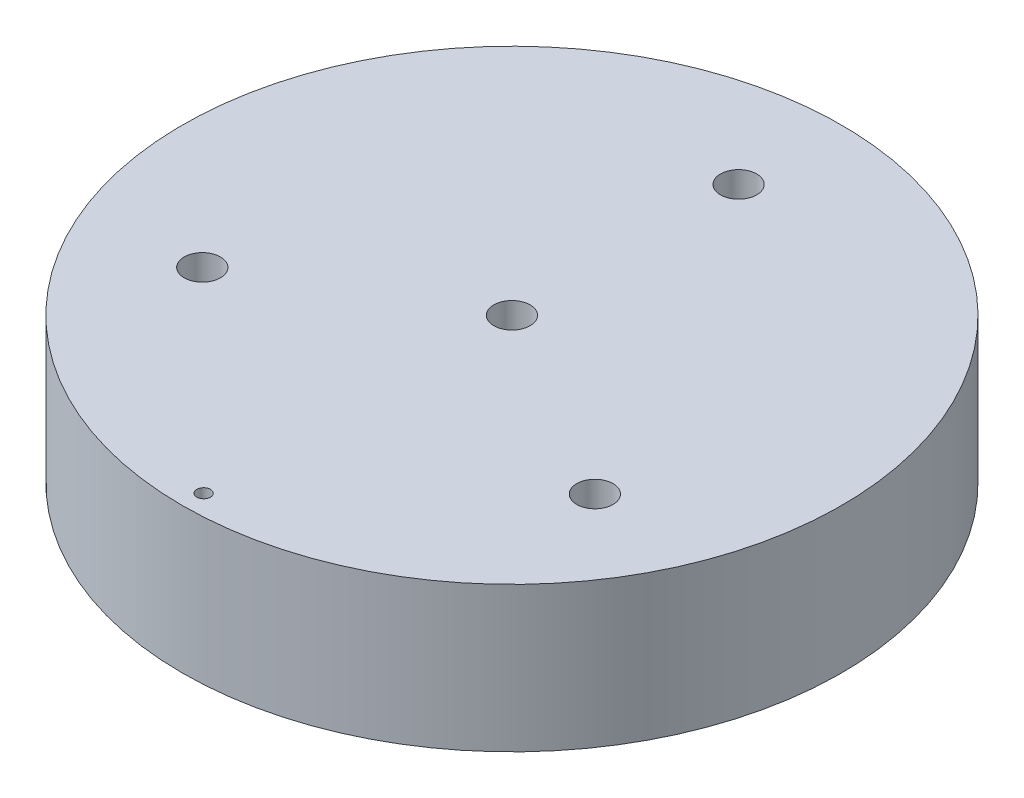
ISO-10303-21;
HEADER;
FILE_DESCRIPTION(('STEP AP214'),'2;1');
FILE_NAME('part.step','',(''),(''),'','','');
FILE_SCHEMA(('AUTOMOTIVE_DESIGN { 1 0 10303 214 1 1 1 1 }'));
ENDSEC;
DATA;
#1=APPLICATION_CONTEXT('core data for automotive mechanical design processes');
#2=APPLICATION_PROTOCOL_DEFINITION('international standard','automotive_design',2000,#1);
#3=PRODUCT_CONTEXT('',#1,'mechanical');
#4=PRODUCT('Part','Part','',(#3));
#5=PRODUCT_RELATED_PRODUCT_CATEGORY('part','',(#4));
#6=PRODUCT_DEFINITION_FORMATION('','',#4);
#7=PRODUCT_DEFINITION_CONTEXT('part definition',#1,'design');
#8=PRODUCT_DEFINITION('design','',#6,#7);
#9=PRODUCT_DEFINITION_SHAPE('','',#8);
#10=(LENGTH_UNIT() NAMED_UNIT(*) SI_UNIT(.MILLI.,.METRE.));
#11=(NAMED_UNIT(*) PLANE_ANGLE_UNIT() SI_UNIT($,.RADIAN.));
#12=(NAMED_UNIT(*) SI_UNIT($,.STERADIAN.) SOLID_ANGLE_UNIT());
#13=UNCERTAINTY_MEASURE_WITH_UNIT(LENGTH_MEASURE(1.E-05),#10,'distance_accuracy_value','');
#14=(GEOMETRIC_REPRESENTATION_CONTEXT(3) GLOBAL_UNCERTAINTY_ASSIGNED_CONTEXT((#13)) GLOBAL_UNIT_ASSIGNED_CONTEXT((#10,
#11,#12)) REPRESENTATION_CONTEXT('',''));
#15=CARTESIAN_POINT('',(0.,0.,0.));
#16=DIRECTION('',(0.,0.,1.));
#17=DIRECTION('',(1.,0.,0.));
#18=AXIS2_PLACEMENT_3D('',#15,#16,#17);
#19=CARTESIAN_POINT('',(0.,32.,0.));
#20=DIRECTION('',(0.,-1.,0.));
#21=DIRECTION('',(0.,0.,-1.));
#22=AXIS2_PLACEMENT_3D('',#19,#20,#21);
#23=CYLINDRICAL_SURFACE('',#22,72.7);
#24=CARTESIAN_POINT('',(0.,32.,0.));
#25=DIRECTION('',(0.,1.,0.));
#26=DIRECTION('',(0.,0.,1.));
#27=AXIS2_PLACEMENT_3D('',#24,#25,#26);
#28=CIRCLE('',#27,72.7);
#29=CARTESIAN_POINT('',(0.,32.,72.7));
#30=VERTEX_POINT('',#29);
#31=EDGE_CURVE('E10',#30,#30,#28,.T.);
#32=ORIENTED_EDGE('',*,*,#31,.F.);
#33=EDGE_LOOP('',(#32));
#34=FACE_BOUND('',#33,.T.);
#35=CARTESIAN_POINT('',(0.,0.,0.));
#36=DIRECTION('',(0.,1.,0.));
#37=DIRECTION('',(0.,0.,1.));
#38=AXIS2_PLACEMENT_3D('',#35,#36,#37);
#39=CIRCLE('',#38,72.7);
#40=CARTESIAN_POINT('',(0.,0.,72.7));
#41=VERTEX_POINT('',#40);
#42=EDGE_CURVE('E35',#41,#41,#39,.T.);
#43=ORIENTED_EDGE('',*,*,#42,.T.);
#44=EDGE_LOOP('',(#43));
#45=FACE_BOUND('',#44,.T.);
#46=ADVANCED_FACE('F32',(#34,#45),#23,.T.);
#47=CARTESIAN_POINT('',(0.,32.,0.));
#48=DIRECTION('',(0.,1.,0.));
#49=DIRECTION('',(0.,0.,1.));
#50=AXIS2_PLACEMENT_3D('',#47,#48,#49);
#51=PLANE('',#50);
#52=CARTESIAN_POINT('',(0.,32.,0.));
#53=DIRECTION('',(0.,1.,0.));
#54=DIRECTION('',(0.,0.,1.));
#55=AXIS2_PLACEMENT_3D('',#52,#53,#54);
#56=CIRCLE('',#55,4.);
#57=CARTESIAN_POINT('',(0.,32.,4.));
#58=VERTEX_POINT('',#57);
#59=EDGE_CURVE('E68',#58,#58,#56,.T.);
#60=ORIENTED_EDGE('',*,*,#59,.F.);
#61=EDGE_LOOP('',(#60));
#62=FACE_BOUND('',#61,.T.);
#63=CARTESIAN_POINT('',(0.,32.,68.));
#64=DIRECTION('',(0.,1.,0.));
#65=DIRECTION('',(0.,0.,1.));
#66=AXIS2_PLACEMENT_3D('',#63,#64,#65);
#67=CIRCLE('',#66,1.5);
#68=CARTESIAN_POINT('',(0.,32.,69.5));
#69=VERTEX_POINT('',#68);
#70=EDGE_CURVE('E62',#69,#69,#67,.T.);
#71=ORIENTED_EDGE('',*,*,#70,.F.);
#72=EDGE_LOOP('',(#71));
#73=FACE_BOUND('',#72,.T.);
#74=CARTESIAN_POINT('',(-43.3012701892222,32.,24.9999999999996));
#75=DIRECTION('',(0.,1.,0.));
#76=DIRECTION('',(0.866025403784443,0.,-0.499999999999992));
#77=AXIS2_PLACEMENT_3D('',#74,#75,#76);
#78=CIRCLE('',#77,4.);
#79=CARTESIAN_POINT('',(-39.8371685740844,32.,22.9999999999996));
#80=VERTEX_POINT('',#79);
#81=EDGE_CURVE('E56',#80,#80,#78,.T.);
#82=ORIENTED_EDGE('',*,*,#81,.F.);
#83=EDGE_LOOP('',(#82));
#84=FACE_BOUND('',#83,.T.);
#85=CARTESIAN_POINT('',(43.3012701892218,32.,25.0000000000002));
#86=DIRECTION('',(0.,1.,0.));
#87=DIRECTION('',(-0.866025403784436,0.,-0.500000000000004));
#88=AXIS2_PLACEMENT_3D('',#85,#86,#87);
#89=CIRCLE('',#88,4.);
#90=CARTESIAN_POINT('',(39.8371685740841,32.,23.0000000000002));
#91=VERTEX_POINT('',#90);
#92=EDGE_CURVE('E50',#91,#91,#89,.T.);
#93=ORIENTED_EDGE('',*,*,#92,.F.);
#94=EDGE_LOOP('',(#93));
#95=FACE_BOUND('',#94,.T.);
#96=CARTESIAN_POINT('',(0.,32.,-50.));
#97=DIRECTION('',(0.,1.,0.));
#98=DIRECTION('',(0.,0.,1.));
#99=AXIS2_PLACEMENT_3D('',#96,#97,#98);
#100=CIRCLE('',#99,4.);
#101=CARTESIAN_POINT('',(0.,32.,-46.));
#102=VERTEX_POINT('',#101);
#103=EDGE_CURVE('E44',#102,#102,#100,.T.);
#104=ORIENTED_EDGE('',*,*,#103,.F.);
#105=EDGE_LOOP('',(#104));
#106=FACE_BOUND('',#105,.T.);
#107=ORIENTED_EDGE('',*,*,#31,.T.);
#108=EDGE_LOOP('',(#107));
#109=FACE_BOUND('',#108,.T.);
#110=ADVANCED_FACE('F84',(#62,#73,#84,#95,#106,#109),#51,.T.);
#111=CARTESIAN_POINT('',(0.,0.,0.));
#112=DIRECTION('',(0.,1.,0.));
#113=DIRECTION('',(0.,0.,1.));
#114=AXIS2_PLACEMENT_3D('',#111,#112,#113);
#115=PLANE('',#114);
#116=CARTESIAN_POINT('',(0.,0.,0.));
#117=DIRECTION('',(0.,1.,0.));
#118=DIRECTION('',(0.,0.,1.));
#119=AXIS2_PLACEMENT_3D('',#116,#117,#118);
#120=CIRCLE('',#119,4.);
#121=CARTESIAN_POINT('',(0.,0.,4.));
#122=VERTEX_POINT('',#121);
#123=EDGE_CURVE('E65',#122,#122,#120,.T.);
#124=ORIENTED_EDGE('',*,*,#123,.T.);
#125=EDGE_LOOP('',(#124));
#126=FACE_BOUND('',#125,.T.);
#127=CARTESIAN_POINT('',(0.,0.,68.));
#128=DIRECTION('',(0.,1.,0.));
#129=DIRECTION('',(0.,0.,1.));
#130=AXIS2_PLACEMENT_3D('',#127,#128,#129);
#131=CIRCLE('',#130,1.5);
#132=CARTESIAN_POINT('',(0.,0.,69.5));
#133=VERTEX_POINT('',#132);
#134=EDGE_CURVE('E59',#133,#133,#131,.T.);
#135=ORIENTED_EDGE('',*,*,#134,.T.);
#136=EDGE_LOOP('',(#135));
#137=FACE_BOUND('',#136,.T.);
#138=CARTESIAN_POINT('',(-43.3012701892222,0.,24.9999999999996));
#139=DIRECTION('',(0.,1.,0.));
#140=DIRECTION('',(0.866025403784443,0.,-0.499999999999992));
#141=AXIS2_PLACEMENT_3D('',#138,#139,#140);
#142=CIRCLE('',#141,4.);
#143=CARTESIAN_POINT('',(-39.8371685740844,0.,22.9999999999996));
#144=VERTEX_POINT('',#143);
#145=EDGE_CURVE('E53',#144,#144,#142,.T.);
#146=ORIENTED_EDGE('',*,*,#145,.T.);
#147=EDGE_LOOP('',(#146));
#148=FACE_BOUND('',#147,.T.);
#149=CARTESIAN_POINT('',(43.3012701892218,0.,25.0000000000002));
#150=DIRECTION('',(0.,1.,0.));
#151=DIRECTION('',(-0.866025403784436,0.,-0.500000000000004));
#152=AXIS2_PLACEMENT_3D('',#149,#150,#151);
#153=CIRCLE('',#152,4.);
#154=CARTESIAN_POINT('',(39.8371685740841,0.,23.0000000000002));
#155=VERTEX_POINT('',#154);
#156=EDGE_CURVE('E47',#155,#155,#153,.T.);
#157=ORIENTED_EDGE('',*,*,#156,.T.);
#158=EDGE_LOOP('',(#157));
#159=FACE_BOUND('',#158,.T.);
#160=CARTESIAN_POINT('',(0.,0.,-50.));
#161=DIRECTION('',(0.,1.,0.));
#162=DIRECTION('',(0.,0.,1.));
#163=AXIS2_PLACEMENT_3D('',#160,#161,#162);
#164=CIRCLE('',#163,4.);
#165=CARTESIAN_POINT('',(0.,0.,-46.));
#166=VERTEX_POINT('',#165);
#167=EDGE_CURVE('E42',#166,#166,#164,.T.);
#168=ORIENTED_EDGE('',*,*,#167,.T.);
#169=EDGE_LOOP('',(#168));
#170=FACE_BOUND('',#169,.T.);
#171=ORIENTED_EDGE('',*,*,#42,.F.);
#172=EDGE_LOOP('',(#171));
#173=FACE_BOUND('',#172,.T.);
#174=ADVANCED_FACE('F74',(#126,#137,#148,#159,#170,#173),#115,.F.);
#175=CARTESIAN_POINT('',(0.,0.,-50.));
#176=DIRECTION('',(0.,1.,0.));
#177=DIRECTION('',(0.,0.,1.));
#178=AXIS2_PLACEMENT_3D('',#175,#176,#177);
#179=CYLINDRICAL_SURFACE('',#178,4.);
#180=ORIENTED_EDGE('',*,*,#167,.F.);
#181=EDGE_LOOP('',(#180));
#182=FACE_BOUND('',#181,.T.);
#183=ORIENTED_EDGE('',*,*,#103,.T.);
#184=EDGE_LOOP('',(#183));
#185=FACE_BOUND('',#184,.T.);
#186=ADVANCED_FACE('F96',(#182,#185),#179,.F.);
#187=CARTESIAN_POINT('',(43.3012701892218,0.,25.0000000000002));
#188=DIRECTION('',(0.,1.,0.));
#189=DIRECTION('',(0.,0.,1.));
#190=AXIS2_PLACEMENT_3D('',#187,#188,#189);
#191=CYLINDRICAL_SURFACE('',#190,4.);
#192=ORIENTED_EDGE('',*,*,#156,.F.);
#193=EDGE_LOOP('',(#192));
#194=FACE_BOUND('',#193,.T.);
#195=ORIENTED_EDGE('',*,*,#92,.T.);
#196=EDGE_LOOP('',(#195));
#197=FACE_BOUND('',#196,.T.);
#198=ADVANCED_FACE('F98',(#194,#197),#191,.F.);
#199=CARTESIAN_POINT('',(-43.3012701892222,0.,24.9999999999996));
#200=DIRECTION('',(0.,1.,0.));
#201=DIRECTION('',(0.,0.,1.));
#202=AXIS2_PLACEMENT_3D('',#199,#200,#201);
#203=CYLINDRICAL_SURFACE('',#202,4.);
#204=ORIENTED_EDGE('',*,*,#145,.F.);
#205=EDGE_LOOP('',(#204));
#206=FACE_BOUND('',#205,.T.);
#207=ORIENTED_EDGE('',*,*,#81,.T.);
#208=EDGE_LOOP('',(#207));
#209=FACE_BOUND('',#208,.T.);
#210=ADVANCED_FACE('F105',(#206,#209),#203,.F.);
#211=CARTESIAN_POINT('',(0.,0.,68.));
#212=DIRECTION('',(0.,1.,0.));
#213=DIRECTION('',(0.,0.,1.));
#214=AXIS2_PLACEMENT_3D('',#211,#212,#213);
#215=CYLINDRICAL_SURFACE('',#214,1.5);
#216=ORIENTED_EDGE('',*,*,#134,.F.);
#217=EDGE_LOOP('',(#216));
#218=FACE_BOUND('',#217,.T.);
#219=ORIENTED_EDGE('',*,*,#70,.T.);
#220=EDGE_LOOP('',(#219));
#221=FACE_BOUND('',#220,.T.);
#222=ADVANCED_FACE('F80',(#218,#221),#215,.F.);
#223=CARTESIAN_POINT('',(0.,0.,0.));
#224=DIRECTION('',(0.,1.,0.));
#225=DIRECTION('',(0.,0.,1.));
#226=AXIS2_PLACEMENT_3D('',#223,#224,#225);
#227=CYLINDRICAL_SURFACE('',#226,4.);
#228=ORIENTED_EDGE('',*,*,#123,.F.);
#229=EDGE_LOOP('',(#228));
#230=FACE_BOUND('',#229,.T.);
#231=ORIENTED_EDGE('',*,*,#59,.T.);
#232=EDGE_LOOP('',(#231));
#233=FACE_BOUND('',#232,.T.);
#234=ADVANCED_FACE('F77',(#230,#233),#227,.F.);
#235=CLOSED_SHELL('',(#46,#110,#174,#186,#198,#210,#222,#234));
#236=MANIFOLD_SOLID_BREP('B2',#235);
#237=ADVANCED_BREP_SHAPE_REPRESENTATION('',(#18,#236),#14);
#238=SHAPE_DEFINITION_REPRESENTATION(#9,#237);
ENDSEC;
END-ISO-10303-21;
